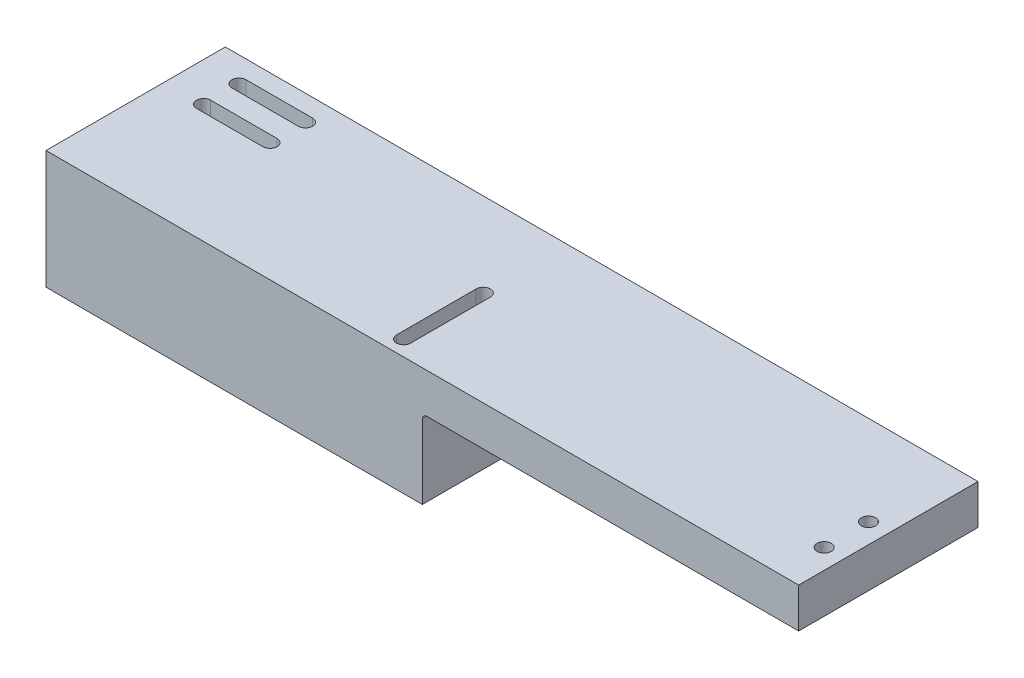
ISO-10303-21;
HEADER;
FILE_DESCRIPTION(('STEP AP214'),'2;1');
FILE_NAME('part.step','',(''),(''),'','','');
FILE_SCHEMA(('AUTOMOTIVE_DESIGN { 1 0 10303 214 1 1 1 1 }'));
ENDSEC;
DATA;
#1=APPLICATION_CONTEXT('core data for automotive mechanical design processes');
#2=APPLICATION_PROTOCOL_DEFINITION('international standard','automotive_design',2000,#1);
#3=PRODUCT_CONTEXT('',#1,'mechanical');
#4=PRODUCT('Part','Part','',(#3));
#5=PRODUCT_RELATED_PRODUCT_CATEGORY('part','',(#4));
#6=PRODUCT_DEFINITION_FORMATION('','',#4);
#7=PRODUCT_DEFINITION_CONTEXT('part definition',#1,'design');
#8=PRODUCT_DEFINITION('design','',#6,#7);
#9=PRODUCT_DEFINITION_SHAPE('','',#8);
#10=(LENGTH_UNIT() NAMED_UNIT(*) SI_UNIT(.MILLI.,.METRE.));
#11=(NAMED_UNIT(*) PLANE_ANGLE_UNIT() SI_UNIT($,.RADIAN.));
#12=(NAMED_UNIT(*) SI_UNIT($,.STERADIAN.) SOLID_ANGLE_UNIT());
#13=UNCERTAINTY_MEASURE_WITH_UNIT(LENGTH_MEASURE(1.E-05),#10,'distance_accuracy_value','');
#14=(GEOMETRIC_REPRESENTATION_CONTEXT(3) GLOBAL_UNCERTAINTY_ASSIGNED_CONTEXT((#13)) GLOBAL_UNIT_ASSIGNED_CONTEXT((#10,
#11,#12)) REPRESENTATION_CONTEXT('',''));
#15=CARTESIAN_POINT('',(0.,0.,0.));
#16=DIRECTION('',(0.,0.,1.));
#17=DIRECTION('',(1.,0.,0.));
#18=AXIS2_PLACEMENT_3D('',#15,#16,#17);
#19=CARTESIAN_POINT('',(0.999999999999986,-1.,0.));
#20=DIRECTION('',(0.,0.,1.));
#21=DIRECTION('',(1.,0.,0.));
#22=AXIS2_PLACEMENT_3D('',#19,#20,#21);
#23=CYLINDRICAL_SURFACE('',#22,1.);
#24=DIRECTION('',(0.,0.,-1.));
#25=VECTOR('',#24,1.);
#26=CARTESIAN_POINT('',(0.999999999999986,0.,0.));
#27=LINE('',#26,#25);
#28=CARTESIAN_POINT('',(0.999999999999973,0.,20.25));
#29=VERTEX_POINT('',#28);
#30=CARTESIAN_POINT('',(0.999999999999973,0.,-20.25));
#31=VERTEX_POINT('',#30);
#32=EDGE_CURVE('E323',#29,#31,#27,.T.);
#33=ORIENTED_EDGE('',*,*,#32,.F.);
#34=CARTESIAN_POINT('',(0.999999999999986,-1.,20.25));
#35=DIRECTION('',(0.,0.,-1.));
#36=DIRECTION('',(-1.,0.,0.));
#37=AXIS2_PLACEMENT_3D('',#34,#35,#36);
#38=CIRCLE('',#37,1.);
#39=CARTESIAN_POINT('',(0.,-1.00000000000001,20.25));
#40=VERTEX_POINT('',#39);
#41=EDGE_CURVE('E41',#29,#40,#38,.F.);
#42=ORIENTED_EDGE('',*,*,#41,.T.);
#43=DIRECTION('',(0.,0.,-1.));
#44=VECTOR('',#43,1.);
#45=CARTESIAN_POINT('',(0.,-1.,0.));
#46=LINE('',#45,#44);
#47=CARTESIAN_POINT('',(0.,-1.00000000000001,-20.25));
#48=VERTEX_POINT('',#47);
#49=EDGE_CURVE('E326',#48,#40,#46,.F.);
#50=ORIENTED_EDGE('',*,*,#49,.F.);
#51=CARTESIAN_POINT('',(0.999999999999986,-1.,-20.25));
#52=DIRECTION('',(0.,0.,1.));
#53=DIRECTION('',(1.,0.,0.));
#54=AXIS2_PLACEMENT_3D('',#51,#52,#53);
#55=CIRCLE('',#54,1.);
#56=EDGE_CURVE('E11',#48,#31,#55,.F.);
#57=ORIENTED_EDGE('',*,*,#56,.T.);
#58=EDGE_LOOP('',(#33,#42,#50,#57));
#59=FACE_BOUND('',#58,.T.);
#60=ADVANCED_FACE('F34',(#59),#23,.F.);
#61=CARTESIAN_POINT('',(0.,0.,0.));
#62=DIRECTION('',(0.,1.,0.));
#63=DIRECTION('',(0.,0.,1.));
#64=AXIS2_PLACEMENT_3D('',#61,#62,#63);
#65=PLANE('',#64);
#66=CARTESIAN_POINT('',(80.5086798676753,0.,10.));
#67=DIRECTION('',(0.,1.,0.));
#68=DIRECTION('',(0.,0.,1.));
#69=AXIS2_PLACEMENT_3D('',#66,#67,#68);
#70=CIRCLE('',#69,1.6);
#71=CARTESIAN_POINT('',(80.5086798676753,0.,11.6));
#72=VERTEX_POINT('',#71);
#73=EDGE_CURVE('E278',#72,#72,#70,.T.);
#74=ORIENTED_EDGE('',*,*,#73,.T.);
#75=EDGE_LOOP('',(#74));
#76=FACE_BOUND('',#75,.T.);
#77=CARTESIAN_POINT('',(80.5086798676753,0.,0.));
#78=DIRECTION('',(0.,1.,0.));
#79=DIRECTION('',(0.,0.,1.));
#80=AXIS2_PLACEMENT_3D('',#77,#78,#79);
#81=CIRCLE('',#80,1.60000000000001);
#82=CARTESIAN_POINT('',(80.5086798676753,0.,1.60000000000001));
#83=VERTEX_POINT('',#82);
#84=EDGE_CURVE('E269',#83,#83,#81,.T.);
#85=ORIENTED_EDGE('',*,*,#84,.T.);
#86=EDGE_LOOP('',(#85));
#87=FACE_BOUND('',#86,.T.);
#88=DIRECTION('',(1.,0.,0.));
#89=VECTOR('',#88,1.);
#90=CARTESIAN_POINT('',(-85.,0.,20.25));
#91=LINE('',#90,#89);
#92=CARTESIAN_POINT('',(85.,0.,20.25));
#93=VERTEX_POINT('',#92);
#94=EDGE_CURVE('E302',#29,#93,#91,.T.);
#95=ORIENTED_EDGE('',*,*,#94,.F.);
#96=ORIENTED_EDGE('',*,*,#32,.T.);
#97=DIRECTION('',(-1.,0.,0.));
#98=VECTOR('',#97,1.);
#99=CARTESIAN_POINT('',(-85.,0.,-20.25));
#100=LINE('',#99,#98);
#101=CARTESIAN_POINT('',(85.,0.,-20.25));
#102=VERTEX_POINT('',#101);
#103=EDGE_CURVE('E311',#102,#31,#100,.T.);
#104=ORIENTED_EDGE('',*,*,#103,.F.);
#105=DIRECTION('',(0.,0.,-1.));
#106=VECTOR('',#105,1.);
#107=CARTESIAN_POINT('',(85.,0.,-20.25));
#108=LINE('',#107,#106);
#109=EDGE_CURVE('E297',#93,#102,#108,.T.);
#110=ORIENTED_EDGE('',*,*,#109,.F.);
#111=EDGE_LOOP('',(#95,#96,#104,#110));
#112=FACE_BOUND('',#111,.T.);
#113=ADVANCED_FACE('F352',(#76,#87,#112),#65,.F.);
#114=CARTESIAN_POINT('',(85.,9.,-20.25));
#115=DIRECTION('',(-1.,0.,0.));
#116=DIRECTION('',(0.,0.,1.));
#117=AXIS2_PLACEMENT_3D('',#114,#115,#116);
#118=PLANE('',#117);
#119=ORIENTED_EDGE('',*,*,#109,.T.);
#120=DIRECTION('',(0.,-1.,0.));
#121=VECTOR('',#120,1.);
#122=CARTESIAN_POINT('',(85.,9.,-20.25));
#123=LINE('',#122,#121);
#124=CARTESIAN_POINT('',(85.,9.,-20.25));
#125=VERTEX_POINT('',#124);
#126=EDGE_CURVE('E320',#125,#102,#123,.T.);
#127=ORIENTED_EDGE('',*,*,#126,.F.);
#128=DIRECTION('',(0.,0.,-1.));
#129=VECTOR('',#128,1.);
#130=CARTESIAN_POINT('',(85.,9.,-20.25));
#131=LINE('',#130,#129);
#132=CARTESIAN_POINT('',(85.,9.,20.25));
#133=VERTEX_POINT('',#132);
#134=EDGE_CURVE('E298',#133,#125,#131,.T.);
#135=ORIENTED_EDGE('',*,*,#134,.F.);
#136=DIRECTION('',(0.,-1.,0.));
#137=VECTOR('',#136,1.);
#138=CARTESIAN_POINT('',(85.,9.,20.25));
#139=LINE('',#138,#137);
#140=EDGE_CURVE('E308',#133,#93,#139,.T.);
#141=ORIENTED_EDGE('',*,*,#140,.T.);
#142=EDGE_LOOP('',(#119,#127,#135,#141));
#143=FACE_BOUND('',#142,.T.);
#144=ADVANCED_FACE('F345',(#143),#118,.F.);
#145=CARTESIAN_POINT('',(-85.,9.,-20.25));
#146=DIRECTION('',(0.,0.,1.));
#147=DIRECTION('',(1.,0.,0.));
#148=AXIS2_PLACEMENT_3D('',#145,#146,#147);
#149=PLANE('',#148);
#150=ORIENTED_EDGE('',*,*,#103,.T.);
#151=ORIENTED_EDGE('',*,*,#56,.F.);
#152=DIRECTION('',(0.,1.,0.));
#153=VECTOR('',#152,1.);
#154=CARTESIAN_POINT('',(0.,-17.745,-20.25));
#155=LINE('',#154,#153);
#156=CARTESIAN_POINT('',(0.,-17.745,-20.25));
#157=VERTEX_POINT('',#156);
#158=EDGE_CURVE('E294',#157,#48,#155,.T.);
#159=ORIENTED_EDGE('',*,*,#158,.F.);
#160=DIRECTION('',(1.,0.,0.));
#161=VECTOR('',#160,1.);
#162=CARTESIAN_POINT('',(-85.,-17.745,-20.25));
#163=LINE('',#162,#161);
#164=CARTESIAN_POINT('',(-85.,-17.745,-20.25));
#165=VERTEX_POINT('',#164);
#166=EDGE_CURVE('E284',#165,#157,#163,.T.);
#167=ORIENTED_EDGE('',*,*,#166,.F.);
#168=DIRECTION('',(0.,-1.,0.));
#169=VECTOR('',#168,1.);
#170=CARTESIAN_POINT('',(-85.,9.,-20.25));
#171=LINE('',#170,#169);
#172=CARTESIAN_POINT('',(-85.,9.,-20.25));
#173=VERTEX_POINT('',#172);
#174=EDGE_CURVE('E318',#173,#165,#171,.T.);
#175=ORIENTED_EDGE('',*,*,#174,.F.);
#176=DIRECTION('',(-1.,0.,0.));
#177=VECTOR('',#176,1.);
#178=CARTESIAN_POINT('',(-85.,9.,-20.25));
#179=LINE('',#178,#177);
#180=EDGE_CURVE('E301',#125,#173,#179,.T.);
#181=ORIENTED_EDGE('',*,*,#180,.F.);
#182=ORIENTED_EDGE('',*,*,#126,.T.);
#183=EDGE_LOOP('',(#150,#151,#159,#167,#175,#181,#182));
#184=FACE_BOUND('',#183,.T.);
#185=ADVANCED_FACE('F343',(#184),#149,.F.);
#186=CARTESIAN_POINT('',(-85.,9.,-20.25));
#187=DIRECTION('',(1.,0.,0.));
#188=DIRECTION('',(0.,0.,-1.));
#189=AXIS2_PLACEMENT_3D('',#186,#187,#188);
#190=PLANE('',#189);
#191=ORIENTED_EDGE('',*,*,#174,.T.);
#192=DIRECTION('',(0.,0.,-1.));
#193=VECTOR('',#192,1.);
#194=CARTESIAN_POINT('',(-85.,-17.745,20.25));
#195=LINE('',#194,#193);
#196=CARTESIAN_POINT('',(-85.,-17.745,20.25));
#197=VERTEX_POINT('',#196);
#198=EDGE_CURVE('E281',#197,#165,#195,.T.);
#199=ORIENTED_EDGE('',*,*,#198,.F.);
#200=DIRECTION('',(0.,-1.,0.));
#201=VECTOR('',#200,1.);
#202=CARTESIAN_POINT('',(-85.,9.,20.25));
#203=LINE('',#202,#201);
#204=CARTESIAN_POINT('',(-85.,9.,20.25));
#205=VERTEX_POINT('',#204);
#206=EDGE_CURVE('E316',#205,#197,#203,.T.);
#207=ORIENTED_EDGE('',*,*,#206,.F.);
#208=DIRECTION('',(0.,0.,1.));
#209=VECTOR('',#208,1.);
#210=CARTESIAN_POINT('',(-85.,9.,-20.25));
#211=LINE('',#210,#209);
#212=EDGE_CURVE('E304',#173,#205,#211,.T.);
#213=ORIENTED_EDGE('',*,*,#212,.F.);
#214=EDGE_LOOP('',(#191,#199,#207,#213));
#215=FACE_BOUND('',#214,.T.);
#216=ADVANCED_FACE('F339',(#215),#190,.F.);
#217=CARTESIAN_POINT('',(-85.,9.,20.25));
#218=DIRECTION('',(0.,0.,-1.));
#219=DIRECTION('',(-1.,0.,0.));
#220=AXIS2_PLACEMENT_3D('',#217,#218,#219);
#221=PLANE('',#220);
#222=ORIENTED_EDGE('',*,*,#41,.F.);
#223=ORIENTED_EDGE('',*,*,#94,.T.);
#224=ORIENTED_EDGE('',*,*,#140,.F.);
#225=DIRECTION('',(1.,0.,0.));
#226=VECTOR('',#225,1.);
#227=CARTESIAN_POINT('',(-85.,9.,20.25));
#228=LINE('',#227,#226);
#229=EDGE_CURVE('E306',#205,#133,#228,.T.);
#230=ORIENTED_EDGE('',*,*,#229,.F.);
#231=ORIENTED_EDGE('',*,*,#206,.T.);
#232=DIRECTION('',(-1.,0.,0.));
#233=VECTOR('',#232,1.);
#234=CARTESIAN_POINT('',(-85.,-17.745,20.25));
#235=LINE('',#234,#233);
#236=CARTESIAN_POINT('',(0.,-17.745,20.25));
#237=VERTEX_POINT('',#236);
#238=EDGE_CURVE('E288',#237,#197,#235,.T.);
#239=ORIENTED_EDGE('',*,*,#238,.F.);
#240=DIRECTION('',(0.,1.,0.));
#241=VECTOR('',#240,1.);
#242=CARTESIAN_POINT('',(0.,-17.745,20.25));
#243=LINE('',#242,#241);
#244=EDGE_CURVE('E291',#237,#40,#243,.T.);
#245=ORIENTED_EDGE('',*,*,#244,.T.);
#246=EDGE_LOOP('',(#222,#223,#224,#230,#231,#239,#245));
#247=FACE_BOUND('',#246,.T.);
#248=ADVANCED_FACE('F333',(#247),#221,.F.);
#249=CARTESIAN_POINT('',(0.,9.,0.));
#250=DIRECTION('',(0.,1.,0.));
#251=DIRECTION('',(0.,0.,1.));
#252=AXIS2_PLACEMENT_3D('',#249,#250,#251);
#253=PLANE('',#252);
#254=CARTESIAN_POINT('',(80.5086798676753,9.,10.));
#255=DIRECTION('',(0.,1.,0.));
#256=DIRECTION('',(0.,0.,1.));
#257=AXIS2_PLACEMENT_3D('',#254,#255,#256);
#258=CIRCLE('',#257,1.6);
#259=CARTESIAN_POINT('',(80.5086798676753,9.,11.6));
#260=VERTEX_POINT('',#259);
#261=EDGE_CURVE('E241',#260,#260,#258,.T.);
#262=ORIENTED_EDGE('',*,*,#261,.F.);
#263=EDGE_LOOP('',(#262));
#264=FACE_BOUND('',#263,.T.);
#265=CARTESIAN_POINT('',(80.5086798676753,9.,0.));
#266=DIRECTION('',(0.,1.,0.));
#267=DIRECTION('',(0.,0.,1.));
#268=AXIS2_PLACEMENT_3D('',#265,#266,#267);
#269=CIRCLE('',#268,1.60000000000001);
#270=CARTESIAN_POINT('',(80.5086798676753,9.,1.60000000000001));
#271=VERTEX_POINT('',#270);
#272=EDGE_CURVE('E224',#271,#271,#269,.T.);
#273=ORIENTED_EDGE('',*,*,#272,.F.);
#274=EDGE_LOOP('',(#273));
#275=FACE_BOUND('',#274,.T.);
#276=CARTESIAN_POINT('',(-7.74132013232477,9.,-1.24920266413459));
#277=DIRECTION('',(0.,1.,0.));
#278=DIRECTION('',(0.,0.,1.));
#279=AXIS2_PLACEMENT_3D('',#276,#277,#278);
#280=CIRCLE('',#279,1.60000000000053);
#281=CARTESIAN_POINT('',(-6.14132013232443,9.,-1.24920266413459));
#282=VERTEX_POINT('',#281);
#283=CARTESIAN_POINT('',(-9.34132013232549,9.,-1.24920266413459));
#284=VERTEX_POINT('',#283);
#285=EDGE_CURVE('E221',#282,#284,#280,.T.);
#286=ORIENTED_EDGE('',*,*,#285,.F.);
#287=DIRECTION('',(0.,0.,-1.));
#288=VECTOR('',#287,1.);
#289=CARTESIAN_POINT('',(-6.14132013232443,9.,-1.24920266413459));
#290=LINE('',#289,#288);
#291=CARTESIAN_POINT('',(-6.14132013232443,9.,16.7507973358654));
#292=VERTEX_POINT('',#291);
#293=EDGE_CURVE('E211',#292,#282,#290,.T.);
#294=ORIENTED_EDGE('',*,*,#293,.F.);
#295=CARTESIAN_POINT('',(-7.74132013232477,9.,16.7507973358654));
#296=DIRECTION('',(0.,1.,0.));
#297=DIRECTION('',(0.,0.,1.));
#298=AXIS2_PLACEMENT_3D('',#295,#296,#297);
#299=CIRCLE('',#298,1.60000000000053);
#300=CARTESIAN_POINT('',(-9.3413201323253,9.,16.7507973358654));
#301=VERTEX_POINT('',#300);
#302=EDGE_CURVE('E227',#301,#292,#299,.T.);
#303=ORIENTED_EDGE('',*,*,#302,.F.);
#304=DIRECTION('',(0.,0.,1.));
#305=VECTOR('',#304,1.);
#306=CARTESIAN_POINT('',(-9.34132013232549,9.,-1.24920266413459));
#307=LINE('',#306,#305);
#308=EDGE_CURVE('E223',#284,#301,#307,.T.);
#309=ORIENTED_EDGE('',*,*,#308,.F.);
#310=EDGE_LOOP('',(#286,#294,#303,#309));
#311=FACE_BOUND('',#310,.T.);
#312=CARTESIAN_POINT('',(-61.2413201323248,9.,-14.585093604663));
#313=DIRECTION('',(0.,1.,0.));
#314=DIRECTION('',(0.,0.,1.));
#315=AXIS2_PLACEMENT_3D('',#312,#313,#314);
#316=CIRCLE('',#315,1.6);
#317=CARTESIAN_POINT('',(-61.2413201323248,9.,-12.985093604663));
#318=VERTEX_POINT('',#317);
#319=CARTESIAN_POINT('',(-61.2413201323248,9.,-16.185093604663));
#320=VERTEX_POINT('',#319);
#321=EDGE_CURVE('E169',#318,#320,#316,.T.);
#322=ORIENTED_EDGE('',*,*,#321,.F.);
#323=DIRECTION('',(1.,0.,0.));
#324=VECTOR('',#323,1.);
#325=CARTESIAN_POINT('',(-61.2413201323248,9.,-12.985093604663));
#326=LINE('',#325,#324);
#327=CARTESIAN_POINT('',(-76.2413201323247,9.,-12.985093604663));
#328=VERTEX_POINT('',#327);
#329=EDGE_CURVE('E187',#328,#318,#326,.T.);
#330=ORIENTED_EDGE('',*,*,#329,.F.);
#331=CARTESIAN_POINT('',(-76.2413201323247,9.,-14.585093604663));
#332=DIRECTION('',(0.,1.,0.));
#333=DIRECTION('',(0.,0.,1.));
#334=AXIS2_PLACEMENT_3D('',#331,#332,#333);
#335=CIRCLE('',#334,1.6);
#336=CARTESIAN_POINT('',(-76.2413201323247,9.,-16.185093604663));
#337=VERTEX_POINT('',#336);
#338=EDGE_CURVE('E190',#337,#328,#335,.T.);
#339=ORIENTED_EDGE('',*,*,#338,.F.);
#340=DIRECTION('',(-1.,0.,0.));
#341=VECTOR('',#340,1.);
#342=CARTESIAN_POINT('',(-61.2413201323248,9.,-16.185093604663));
#343=LINE('',#342,#341);
#344=EDGE_CURVE('E196',#320,#337,#343,.T.);
#345=ORIENTED_EDGE('',*,*,#344,.F.);
#346=EDGE_LOOP('',(#322,#330,#339,#345));
#347=FACE_BOUND('',#346,.T.);
#348=CARTESIAN_POINT('',(-76.2413201323247,9.,-6.58509360466298));
#349=DIRECTION('',(0.,1.,0.));
#350=DIRECTION('',(0.,0.,1.));
#351=AXIS2_PLACEMENT_3D('',#348,#349,#350);
#352=CIRCLE('',#351,1.6);
#353=CARTESIAN_POINT('',(-76.2413201323247,9.,-8.18509360466298));
#354=VERTEX_POINT('',#353);
#355=CARTESIAN_POINT('',(-76.2413201323247,9.,-4.98509360466297));
#356=VERTEX_POINT('',#355);
#357=EDGE_CURVE('E203',#354,#356,#352,.T.);
#358=ORIENTED_EDGE('',*,*,#357,.F.);
#359=DIRECTION('',(-1.,0.,0.));
#360=VECTOR('',#359,1.);
#361=CARTESIAN_POINT('',(-76.2413201323247,9.,-8.18509360466298));
#362=LINE('',#361,#360);
#363=CARTESIAN_POINT('',(-61.2413201323248,9.,-8.18509360466298));
#364=VERTEX_POINT('',#363);
#365=EDGE_CURVE('E248',#364,#354,#362,.T.);
#366=ORIENTED_EDGE('',*,*,#365,.F.);
#367=CARTESIAN_POINT('',(-61.2413201323248,9.,-6.58509360466298));
#368=DIRECTION('',(0.,1.,0.));
#369=DIRECTION('',(0.,0.,1.));
#370=AXIS2_PLACEMENT_3D('',#367,#368,#369);
#371=CIRCLE('',#370,1.6);
#372=CARTESIAN_POINT('',(-61.2413201323248,9.,-4.98509360466298));
#373=VERTEX_POINT('',#372);
#374=EDGE_CURVE('E262',#373,#364,#371,.T.);
#375=ORIENTED_EDGE('',*,*,#374,.F.);
#376=DIRECTION('',(1.,0.,0.));
#377=VECTOR('',#376,1.);
#378=CARTESIAN_POINT('',(-76.2413201323247,9.,-4.98509360466297));
#379=LINE('',#378,#377);
#380=EDGE_CURVE('E259',#356,#373,#379,.T.);
#381=ORIENTED_EDGE('',*,*,#380,.F.);
#382=EDGE_LOOP('',(#358,#366,#375,#381));
#383=FACE_BOUND('',#382,.T.);
#384=ORIENTED_EDGE('',*,*,#134,.T.);
#385=ORIENTED_EDGE('',*,*,#180,.T.);
#386=ORIENTED_EDGE('',*,*,#212,.T.);
#387=ORIENTED_EDGE('',*,*,#229,.T.);
#388=EDGE_LOOP('',(#384,#385,#386,#387));
#389=FACE_BOUND('',#388,.T.);
#390=ADVANCED_FACE('F367',(#264,#275,#311,#347,#383,#389),#253,.T.);
#391=CARTESIAN_POINT('',(0.,-17.745,20.25));
#392=DIRECTION('',(-1.,0.,0.));
#393=DIRECTION('',(0.,0.,1.));
#394=AXIS2_PLACEMENT_3D('',#391,#392,#393);
#395=PLANE('',#394);
#396=ORIENTED_EDGE('',*,*,#158,.T.);
#397=ORIENTED_EDGE('',*,*,#49,.T.);
#398=ORIENTED_EDGE('',*,*,#244,.F.);
#399=DIRECTION('',(0.,0.,1.));
#400=VECTOR('',#399,1.);
#401=CARTESIAN_POINT('',(0.,-17.745,20.25));
#402=LINE('',#401,#400);
#403=EDGE_CURVE('E286',#157,#237,#402,.T.);
#404=ORIENTED_EDGE('',*,*,#403,.F.);
#405=EDGE_LOOP('',(#396,#397,#398,#404));
#406=FACE_BOUND('',#405,.T.);
#407=ADVANCED_FACE('F329',(#406),#395,.F.);
#408=CARTESIAN_POINT('',(0.,-17.745,0.));
#409=DIRECTION('',(0.,-1.,0.));
#410=DIRECTION('',(0.,0.,-1.));
#411=AXIS2_PLACEMENT_3D('',#408,#409,#410);
#412=PLANE('',#411);
#413=CARTESIAN_POINT('',(-7.74132013232477,-17.745,-1.24920266413459));
#414=DIRECTION('',(0.,1.,0.));
#415=DIRECTION('',(0.,0.,1.));
#416=AXIS2_PLACEMENT_3D('',#413,#414,#415);
#417=CIRCLE('',#416,1.60000000000053);
#418=CARTESIAN_POINT('',(-6.14132013232443,-17.745,-1.24920266413459));
#419=VERTEX_POINT('',#418);
#420=CARTESIAN_POINT('',(-9.34132013232549,-17.745,-1.24920266413459));
#421=VERTEX_POINT('',#420);
#422=EDGE_CURVE('E207',#419,#421,#417,.T.);
#423=ORIENTED_EDGE('',*,*,#422,.T.);
#424=DIRECTION('',(0.,0.,1.));
#425=VECTOR('',#424,1.);
#426=CARTESIAN_POINT('',(-9.34132013232549,-17.745,-1.24920266413459));
#427=LINE('',#426,#425);
#428=CARTESIAN_POINT('',(-9.34132013232549,-17.745,16.7507973358654));
#429=VERTEX_POINT('',#428);
#430=EDGE_CURVE('E210',#421,#429,#427,.T.);
#431=ORIENTED_EDGE('',*,*,#430,.T.);
#432=CARTESIAN_POINT('',(-7.74132013232477,-17.745,16.7507973358654));
#433=DIRECTION('',(0.,1.,0.));
#434=DIRECTION('',(0.,0.,1.));
#435=AXIS2_PLACEMENT_3D('',#432,#433,#434);
#436=CIRCLE('',#435,1.60000000000053);
#437=CARTESIAN_POINT('',(-6.14132013232443,-17.745,16.7507973358654));
#438=VERTEX_POINT('',#437);
#439=EDGE_CURVE('E214',#429,#438,#436,.T.);
#440=ORIENTED_EDGE('',*,*,#439,.T.);
#441=DIRECTION('',(0.,0.,-1.));
#442=VECTOR('',#441,1.);
#443=CARTESIAN_POINT('',(-6.14132013232443,-17.745,-1.24920266413459));
#444=LINE('',#443,#442);
#445=EDGE_CURVE('E217',#438,#419,#444,.T.);
#446=ORIENTED_EDGE('',*,*,#445,.T.);
#447=EDGE_LOOP('',(#423,#431,#440,#446));
#448=FACE_BOUND('',#447,.T.);
#449=CARTESIAN_POINT('',(-61.2413201323248,-17.745,-14.585093604663));
#450=DIRECTION('',(0.,1.,0.));
#451=DIRECTION('',(0.,0.,1.));
#452=AXIS2_PLACEMENT_3D('',#449,#450,#451);
#453=CIRCLE('',#452,1.6);
#454=CARTESIAN_POINT('',(-61.2413201323248,-17.745,-12.985093604663));
#455=VERTEX_POINT('',#454);
#456=CARTESIAN_POINT('',(-61.2413201323248,-17.745,-16.185093604663));
#457=VERTEX_POINT('',#456);
#458=EDGE_CURVE('E166',#455,#457,#453,.T.);
#459=ORIENTED_EDGE('',*,*,#458,.T.);
#460=DIRECTION('',(-1.,0.,0.));
#461=VECTOR('',#460,1.);
#462=CARTESIAN_POINT('',(-61.2413201323248,-17.745,-16.185093604663));
#463=LINE('',#462,#461);
#464=CARTESIAN_POINT('',(-76.2413201323247,-17.745,-16.185093604663));
#465=VERTEX_POINT('',#464);
#466=EDGE_CURVE('E178',#457,#465,#463,.T.);
#467=ORIENTED_EDGE('',*,*,#466,.T.);
#468=CARTESIAN_POINT('',(-76.2413201323247,-17.745,-14.585093604663));
#469=DIRECTION('',(0.,1.,0.));
#470=DIRECTION('',(0.,0.,1.));
#471=AXIS2_PLACEMENT_3D('',#468,#469,#470);
#472=CIRCLE('',#471,1.6);
#473=CARTESIAN_POINT('',(-76.2413201323247,-17.745,-12.985093604663));
#474=VERTEX_POINT('',#473);
#475=EDGE_CURVE('E182',#465,#474,#472,.T.);
#476=ORIENTED_EDGE('',*,*,#475,.T.);
#477=DIRECTION('',(1.,0.,0.));
#478=VECTOR('',#477,1.);
#479=CARTESIAN_POINT('',(-61.2413201323248,-17.745,-12.985093604663));
#480=LINE('',#479,#478);
#481=EDGE_CURVE('E174',#474,#455,#480,.T.);
#482=ORIENTED_EDGE('',*,*,#481,.T.);
#483=EDGE_LOOP('',(#459,#467,#476,#482));
#484=FACE_BOUND('',#483,.T.);
#485=CARTESIAN_POINT('',(-76.2413201323247,-17.745,-6.58509360466298));
#486=DIRECTION('',(0.,1.,0.));
#487=DIRECTION('',(0.,0.,1.));
#488=AXIS2_PLACEMENT_3D('',#485,#486,#487);
#489=CIRCLE('',#488,1.6);
#490=CARTESIAN_POINT('',(-76.2413201323247,-17.745,-8.18509360466298));
#491=VERTEX_POINT('',#490);
#492=CARTESIAN_POINT('',(-76.2413201323247,-17.745,-4.98509360466297));
#493=VERTEX_POINT('',#492);
#494=EDGE_CURVE('E244',#491,#493,#489,.T.);
#495=ORIENTED_EDGE('',*,*,#494,.T.);
#496=DIRECTION('',(1.,0.,0.));
#497=VECTOR('',#496,1.);
#498=CARTESIAN_POINT('',(-76.2413201323247,-17.745,-4.98509360466297));
#499=LINE('',#498,#497);
#500=CARTESIAN_POINT('',(-61.2413201323248,-17.745,-4.98509360466298));
#501=VERTEX_POINT('',#500);
#502=EDGE_CURVE('E247',#493,#501,#499,.T.);
#503=ORIENTED_EDGE('',*,*,#502,.T.);
#504=CARTESIAN_POINT('',(-61.2413201323248,-17.745,-6.58509360466298));
#505=DIRECTION('',(0.,1.,0.));
#506=DIRECTION('',(0.,0.,1.));
#507=AXIS2_PLACEMENT_3D('',#504,#505,#506);
#508=CIRCLE('',#507,1.6);
#509=CARTESIAN_POINT('',(-61.2413201323248,-17.745,-8.18509360466298));
#510=VERTEX_POINT('',#509);
#511=EDGE_CURVE('E251',#501,#510,#508,.T.);
#512=ORIENTED_EDGE('',*,*,#511,.T.);
#513=DIRECTION('',(-1.,0.,0.));
#514=VECTOR('',#513,1.);
#515=CARTESIAN_POINT('',(-76.2413201323247,-17.745,-8.18509360466298));
#516=LINE('',#515,#514);
#517=EDGE_CURVE('E254',#510,#491,#516,.T.);
#518=ORIENTED_EDGE('',*,*,#517,.T.);
#519=EDGE_LOOP('',(#495,#503,#512,#518));
#520=FACE_BOUND('',#519,.T.);
#521=ORIENTED_EDGE('',*,*,#198,.T.);
#522=ORIENTED_EDGE('',*,*,#166,.T.);
#523=ORIENTED_EDGE('',*,*,#403,.T.);
#524=ORIENTED_EDGE('',*,*,#238,.T.);
#525=EDGE_LOOP('',(#521,#522,#523,#524));
#526=FACE_BOUND('',#525,.T.);
#527=ADVANCED_FACE('F184',(#448,#484,#520,#526),#412,.T.);
#528=CARTESIAN_POINT('',(-76.2413201323247,-17.745,-6.58509360466298));
#529=DIRECTION('',(0.,1.,0.));
#530=DIRECTION('',(0.,0.,1.));
#531=AXIS2_PLACEMENT_3D('',#528,#529,#530);
#532=CYLINDRICAL_SURFACE('',#531,1.6);
#533=ORIENTED_EDGE('',*,*,#357,.T.);
#534=DIRECTION('',(0.,1.,0.));
#535=VECTOR('',#534,1.);
#536=CARTESIAN_POINT('',(-76.2413201323247,-17.745,-4.98509360466297));
#537=LINE('',#536,#535);
#538=EDGE_CURVE('E257',#493,#356,#537,.T.);
#539=ORIENTED_EDGE('',*,*,#538,.F.);
#540=ORIENTED_EDGE('',*,*,#494,.F.);
#541=DIRECTION('',(0.,1.,0.));
#542=VECTOR('',#541,1.);
#543=CARTESIAN_POINT('',(-76.2413201323247,-17.745,-8.18509360466298));
#544=LINE('',#543,#542);
#545=EDGE_CURVE('E267',#491,#354,#544,.T.);
#546=ORIENTED_EDGE('',*,*,#545,.T.);
#547=EDGE_LOOP('',(#533,#539,#540,#546));
#548=FACE_BOUND('',#547,.T.);
#549=ADVANCED_FACE('F382',(#548),#532,.F.);
#550=CARTESIAN_POINT('',(-76.2413201323247,-17.745,-8.18509360466298));
#551=DIRECTION('',(0.,0.,-1.));
#552=DIRECTION('',(-1.,0.,0.));
#553=AXIS2_PLACEMENT_3D('',#550,#551,#552);
#554=PLANE('',#553);
#555=ORIENTED_EDGE('',*,*,#365,.T.);
#556=ORIENTED_EDGE('',*,*,#545,.F.);
#557=ORIENTED_EDGE('',*,*,#517,.F.);
#558=DIRECTION('',(0.,1.,0.));
#559=VECTOR('',#558,1.);
#560=CARTESIAN_POINT('',(-61.2413201323248,-17.745,-8.18509360466298));
#561=LINE('',#560,#559);
#562=EDGE_CURVE('E270',#510,#364,#561,.T.);
#563=ORIENTED_EDGE('',*,*,#562,.T.);
#564=EDGE_LOOP('',(#555,#556,#557,#563));
#565=FACE_BOUND('',#564,.T.);
#566=ADVANCED_FACE('F386',(#565),#554,.F.);
#567=CARTESIAN_POINT('',(-61.2413201323248,-17.745,-6.58509360466298));
#568=DIRECTION('',(0.,1.,0.));
#569=DIRECTION('',(0.,0.,1.));
#570=AXIS2_PLACEMENT_3D('',#567,#568,#569);
#571=CYLINDRICAL_SURFACE('',#570,1.6);
#572=ORIENTED_EDGE('',*,*,#374,.T.);
#573=ORIENTED_EDGE('',*,*,#562,.F.);
#574=ORIENTED_EDGE('',*,*,#511,.F.);
#575=DIRECTION('',(0.,1.,0.));
#576=VECTOR('',#575,1.);
#577=CARTESIAN_POINT('',(-61.2413201323248,-17.745,-4.98509360466298));
#578=LINE('',#577,#576);
#579=EDGE_CURVE('E272',#501,#373,#578,.T.);
#580=ORIENTED_EDGE('',*,*,#579,.T.);
#581=EDGE_LOOP('',(#572,#573,#574,#580));
#582=FACE_BOUND('',#581,.T.);
#583=ADVANCED_FACE('F391',(#582),#571,.F.);
#584=CARTESIAN_POINT('',(-76.2413201323247,-17.745,-4.98509360466297));
#585=DIRECTION('',(0.,0.,1.));
#586=DIRECTION('',(1.,0.,0.));
#587=AXIS2_PLACEMENT_3D('',#584,#585,#586);
#588=PLANE('',#587);
#589=ORIENTED_EDGE('',*,*,#380,.T.);
#590=ORIENTED_EDGE('',*,*,#579,.F.);
#591=ORIENTED_EDGE('',*,*,#502,.F.);
#592=ORIENTED_EDGE('',*,*,#538,.T.);
#593=EDGE_LOOP('',(#589,#590,#591,#592));
#594=FACE_BOUND('',#593,.T.);
#595=ADVANCED_FACE('F388',(#594),#588,.F.);
#596=CARTESIAN_POINT('',(-61.2413201323248,-17.745,-14.585093604663));
#597=DIRECTION('',(0.,1.,0.));
#598=DIRECTION('',(0.,0.,1.));
#599=AXIS2_PLACEMENT_3D('',#596,#597,#598);
#600=CYLINDRICAL_SURFACE('',#599,1.6);
#601=ORIENTED_EDGE('',*,*,#321,.T.);
#602=DIRECTION('',(0.,1.,0.));
#603=VECTOR('',#602,1.);
#604=CARTESIAN_POINT('',(-61.2413201323248,-17.745,-16.185093604663));
#605=LINE('',#604,#603);
#606=EDGE_CURVE('E162',#457,#320,#605,.T.);
#607=ORIENTED_EDGE('',*,*,#606,.F.);
#608=ORIENTED_EDGE('',*,*,#458,.F.);
#609=DIRECTION('',(0.,1.,0.));
#610=VECTOR('',#609,1.);
#611=CARTESIAN_POINT('',(-61.2413201323248,-17.745,-12.985093604663));
#612=LINE('',#611,#610);
#613=EDGE_CURVE('E201',#455,#318,#612,.T.);
#614=ORIENTED_EDGE('',*,*,#613,.T.);
#615=EDGE_LOOP('',(#601,#607,#608,#614));
#616=FACE_BOUND('',#615,.T.);
#617=ADVANCED_FACE('F164',(#616),#600,.F.);
#618=CARTESIAN_POINT('',(-61.2413201323248,-17.745,-12.985093604663));
#619=DIRECTION('',(0.,0.,1.));
#620=DIRECTION('',(1.,0.,0.));
#621=AXIS2_PLACEMENT_3D('',#618,#619,#620);
#622=PLANE('',#621);
#623=ORIENTED_EDGE('',*,*,#329,.T.);
#624=ORIENTED_EDGE('',*,*,#613,.F.);
#625=ORIENTED_EDGE('',*,*,#481,.F.);
#626=DIRECTION('',(0.,1.,0.));
#627=VECTOR('',#626,1.);
#628=CARTESIAN_POINT('',(-76.2413201323247,-17.745,-12.985093604663));
#629=LINE('',#628,#627);
#630=EDGE_CURVE('E204',#474,#328,#629,.T.);
#631=ORIENTED_EDGE('',*,*,#630,.T.);
#632=EDGE_LOOP('',(#623,#624,#625,#631));
#633=FACE_BOUND('',#632,.T.);
#634=ADVANCED_FACE('F425',(#633),#622,.F.);
#635=CARTESIAN_POINT('',(-76.2413201323247,-17.745,-14.585093604663));
#636=DIRECTION('',(0.,1.,0.));
#637=DIRECTION('',(0.,0.,1.));
#638=AXIS2_PLACEMENT_3D('',#635,#636,#637);
#639=CYLINDRICAL_SURFACE('',#638,1.6);
#640=ORIENTED_EDGE('',*,*,#338,.T.);
#641=ORIENTED_EDGE('',*,*,#630,.F.);
#642=ORIENTED_EDGE('',*,*,#475,.F.);
#643=DIRECTION('',(0.,1.,0.));
#644=VECTOR('',#643,1.);
#645=CARTESIAN_POINT('',(-76.2413201323247,-17.745,-16.185093604663));
#646=LINE('',#645,#644);
#647=EDGE_CURVE('E173',#465,#337,#646,.T.);
#648=ORIENTED_EDGE('',*,*,#647,.T.);
#649=EDGE_LOOP('',(#640,#641,#642,#648));
#650=FACE_BOUND('',#649,.T.);
#651=ADVANCED_FACE('F428',(#650),#639,.F.);
#652=CARTESIAN_POINT('',(-61.2413201323248,-17.745,-16.185093604663));
#653=DIRECTION('',(0.,0.,-1.));
#654=DIRECTION('',(-1.,0.,0.));
#655=AXIS2_PLACEMENT_3D('',#652,#653,#654);
#656=PLANE('',#655);
#657=ORIENTED_EDGE('',*,*,#344,.T.);
#658=ORIENTED_EDGE('',*,*,#647,.F.);
#659=ORIENTED_EDGE('',*,*,#466,.F.);
#660=ORIENTED_EDGE('',*,*,#606,.T.);
#661=EDGE_LOOP('',(#657,#658,#659,#660));
#662=FACE_BOUND('',#661,.T.);
#663=ADVANCED_FACE('F179',(#662),#656,.F.);
#664=CARTESIAN_POINT('',(-7.74132013232477,-17.745,-1.24920266413459));
#665=DIRECTION('',(0.,1.,0.));
#666=DIRECTION('',(0.,0.,1.));
#667=AXIS2_PLACEMENT_3D('',#664,#665,#666);
#668=CYLINDRICAL_SURFACE('',#667,1.60000000000053);
#669=ORIENTED_EDGE('',*,*,#285,.T.);
#670=DIRECTION('',(0.,1.,0.));
#671=VECTOR('',#670,1.);
#672=CARTESIAN_POINT('',(-9.34132013232549,-17.745,-1.24920266413459));
#673=LINE('',#672,#671);
#674=EDGE_CURVE('E220',#421,#284,#673,.T.);
#675=ORIENTED_EDGE('',*,*,#674,.F.);
#676=ORIENTED_EDGE('',*,*,#422,.F.);
#677=DIRECTION('',(0.,1.,0.));
#678=VECTOR('',#677,1.);
#679=CARTESIAN_POINT('',(-6.14132013232443,-17.745,-1.24920266413459));
#680=LINE('',#679,#678);
#681=EDGE_CURVE('E197',#419,#282,#680,.T.);
#682=ORIENTED_EDGE('',*,*,#681,.T.);
#683=EDGE_LOOP('',(#669,#675,#676,#682));
#684=FACE_BOUND('',#683,.T.);
#685=ADVANCED_FACE('F408',(#684),#668,.F.);
#686=CARTESIAN_POINT('',(-6.14132013232443,-17.745,-1.24920266413459));
#687=DIRECTION('',(1.,0.,0.));
#688=DIRECTION('',(0.,0.,-1.));
#689=AXIS2_PLACEMENT_3D('',#686,#687,#688);
#690=PLANE('',#689);
#691=ORIENTED_EDGE('',*,*,#293,.T.);
#692=ORIENTED_EDGE('',*,*,#681,.F.);
#693=ORIENTED_EDGE('',*,*,#445,.F.);
#694=DIRECTION('',(0.,1.,0.));
#695=VECTOR('',#694,1.);
#696=CARTESIAN_POINT('',(-6.14132013232443,-17.745,16.7507973358654));
#697=LINE('',#696,#695);
#698=EDGE_CURVE('E233',#438,#292,#697,.T.);
#699=ORIENTED_EDGE('',*,*,#698,.T.);
#700=EDGE_LOOP('',(#691,#692,#693,#699));
#701=FACE_BOUND('',#700,.T.);
#702=ADVANCED_FACE('F411',(#701),#690,.F.);
#703=CARTESIAN_POINT('',(-7.74132013232477,-17.745,16.7507973358654));
#704=DIRECTION('',(0.,1.,0.));
#705=DIRECTION('',(0.,0.,1.));
#706=AXIS2_PLACEMENT_3D('',#703,#704,#705);
#707=CYLINDRICAL_SURFACE('',#706,1.60000000000053);
#708=ORIENTED_EDGE('',*,*,#302,.T.);
#709=ORIENTED_EDGE('',*,*,#698,.F.);
#710=ORIENTED_EDGE('',*,*,#439,.F.);
#711=DIRECTION('',(0.,1.,0.));
#712=VECTOR('',#711,1.);
#713=CARTESIAN_POINT('',(-9.3413201323253,-17.745,16.7507973358654));
#714=LINE('',#713,#712);
#715=EDGE_CURVE('E235',#429,#301,#714,.T.);
#716=ORIENTED_EDGE('',*,*,#715,.T.);
#717=EDGE_LOOP('',(#708,#709,#710,#716));
#718=FACE_BOUND('',#717,.T.);
#719=ADVANCED_FACE('F415',(#718),#707,.F.);
#720=CARTESIAN_POINT('',(-9.34132013232549,-17.745,-1.24920266413459));
#721=DIRECTION('',(-1.,0.,0.));
#722=DIRECTION('',(0.,0.,1.));
#723=AXIS2_PLACEMENT_3D('',#720,#721,#722);
#724=PLANE('',#723);
#725=ORIENTED_EDGE('',*,*,#308,.T.);
#726=ORIENTED_EDGE('',*,*,#715,.F.);
#727=ORIENTED_EDGE('',*,*,#430,.F.);
#728=ORIENTED_EDGE('',*,*,#674,.T.);
#729=EDGE_LOOP('',(#725,#726,#727,#728));
#730=FACE_BOUND('',#729,.T.);
#731=ADVANCED_FACE('F406',(#730),#724,.F.);
#732=CARTESIAN_POINT('',(80.5086798676753,-17.745,0.));
#733=DIRECTION('',(0.,1.,0.));
#734=DIRECTION('',(0.,0.,1.));
#735=AXIS2_PLACEMENT_3D('',#732,#733,#734);
#736=CYLINDRICAL_SURFACE('',#735,1.60000000000001);
#737=ORIENTED_EDGE('',*,*,#272,.T.);
#738=EDGE_LOOP('',(#737));
#739=FACE_BOUND('',#738,.T.);
#740=ORIENTED_EDGE('',*,*,#84,.F.);
#741=EDGE_LOOP('',(#740));
#742=FACE_BOUND('',#741,.T.);
#743=ADVANCED_FACE('F402',(#739,#742),#736,.F.);
#744=CARTESIAN_POINT('',(80.5086798676753,-17.745,10.));
#745=DIRECTION('',(0.,1.,0.));
#746=DIRECTION('',(0.,0.,1.));
#747=AXIS2_PLACEMENT_3D('',#744,#745,#746);
#748=CYLINDRICAL_SURFACE('',#747,1.6);
#749=ORIENTED_EDGE('',*,*,#261,.T.);
#750=EDGE_LOOP('',(#749));
#751=FACE_BOUND('',#750,.T.);
#752=ORIENTED_EDGE('',*,*,#73,.F.);
#753=EDGE_LOOP('',(#752));
#754=FACE_BOUND('',#753,.T.);
#755=ADVANCED_FACE('F399',(#751,#754),#748,.F.);
#756=CLOSED_SHELL('',(#60,#113,#144,#185,#216,#248,#390,#407,#527,#549,#566,#583,#595,#617,#634,
#651,#663,#685,#702,#719,#731,#743,#755));
#757=MANIFOLD_SOLID_BREP('B2',#756);
#758=ADVANCED_BREP_SHAPE_REPRESENTATION('',(#18,#757),#14);
#759=SHAPE_DEFINITION_REPRESENTATION(#9,#758);
ENDSEC;
END-ISO-10303-21;
